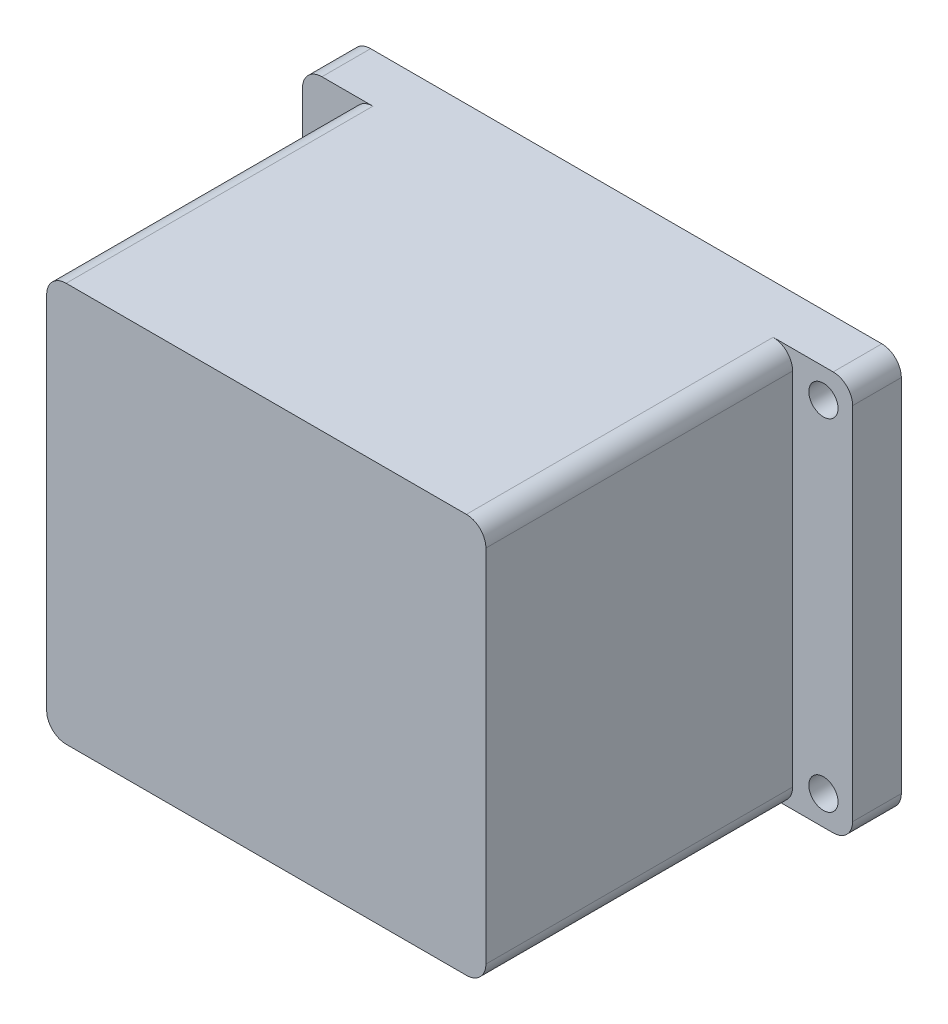
ISO-10303-21;
HEADER;
FILE_DESCRIPTION(('STEP AP214'),'2;1');
FILE_NAME('part.step','',(''),(''),'','','');
FILE_SCHEMA(('AUTOMOTIVE_DESIGN { 1 0 10303 214 1 1 1 1 }'));
ENDSEC;
DATA;
#1=APPLICATION_CONTEXT('core data for automotive mechanical design processes');
#2=APPLICATION_PROTOCOL_DEFINITION('international standard','automotive_design',2000,#1);
#3=PRODUCT_CONTEXT('',#1,'mechanical');
#4=PRODUCT('Part','Part','',(#3));
#5=PRODUCT_RELATED_PRODUCT_CATEGORY('part','',(#4));
#6=PRODUCT_DEFINITION_FORMATION('','',#4);
#7=PRODUCT_DEFINITION_CONTEXT('part definition',#1,'design');
#8=PRODUCT_DEFINITION('design','',#6,#7);
#9=PRODUCT_DEFINITION_SHAPE('','',#8);
#10=(LENGTH_UNIT() NAMED_UNIT(*) SI_UNIT(.MILLI.,.METRE.));
#11=(NAMED_UNIT(*) PLANE_ANGLE_UNIT() SI_UNIT($,.RADIAN.));
#12=(NAMED_UNIT(*) SI_UNIT($,.STERADIAN.) SOLID_ANGLE_UNIT());
#13=UNCERTAINTY_MEASURE_WITH_UNIT(LENGTH_MEASURE(1.E-05),#10,'distance_accuracy_value','');
#14=(GEOMETRIC_REPRESENTATION_CONTEXT(3) GLOBAL_UNCERTAINTY_ASSIGNED_CONTEXT((#13)) GLOBAL_UNIT_ASSIGNED_CONTEXT((#10,
#11,#12)) REPRESENTATION_CONTEXT('',''));
#15=CARTESIAN_POINT('',(0.,0.,0.));
#16=DIRECTION('',(0.,0.,1.));
#17=DIRECTION('',(1.,0.,0.));
#18=AXIS2_PLACEMENT_3D('',#15,#16,#17);
#19=CARTESIAN_POINT('',(0.,0.,5.));
#20=DIRECTION('',(0.,0.,-1.));
#21=DIRECTION('',(-1.,0.,0.));
#22=AXIS2_PLACEMENT_3D('',#19,#20,#21);
#23=PLANE('',#22);
#24=CARTESIAN_POINT('',(53.5,3.,5.));
#25=DIRECTION('',(0.,0.,1.));
#26=DIRECTION('',(1.,0.,0.));
#27=AXIS2_PLACEMENT_3D('',#24,#25,#26);
#28=CIRCLE('',#27,1.5);
#29=CARTESIAN_POINT('',(55.,3.,5.));
#30=VERTEX_POINT('',#29);
#31=EDGE_CURVE('E274',#30,#30,#28,.T.);
#32=ORIENTED_EDGE('',*,*,#31,.F.);
#33=EDGE_LOOP('',(#32));
#34=FACE_BOUND('',#33,.T.);
#35=CARTESIAN_POINT('',(53.5,38.,5.));
#36=DIRECTION('',(0.,0.,1.));
#37=DIRECTION('',(1.,0.,0.));
#38=AXIS2_PLACEMENT_3D('',#35,#36,#37);
#39=CIRCLE('',#38,1.5);
#40=CARTESIAN_POINT('',(55.,38.,5.));
#41=VERTEX_POINT('',#40);
#42=EDGE_CURVE('E280',#41,#41,#39,.T.);
#43=ORIENTED_EDGE('',*,*,#42,.F.);
#44=EDGE_LOOP('',(#43));
#45=FACE_BOUND('',#44,.T.);
#46=DIRECTION('',(0.,1.,0.));
#47=VECTOR('',#46,1.);
#48=CARTESIAN_POINT('',(50.3352560695731,0.,5.));
#49=LINE('',#48,#47);
#50=CARTESIAN_POINT('',(50.3352560695731,2.,5.));
#51=VERTEX_POINT('',#50);
#52=CARTESIAN_POINT('',(50.3352560695731,39.,5.));
#53=VERTEX_POINT('',#52);
#54=EDGE_CURVE('E242',#51,#53,#49,.T.);
#55=ORIENTED_EDGE('',*,*,#54,.F.);
#56=CARTESIAN_POINT('',(48.3352560695731,2.,5.));
#57=DIRECTION('',(0.,0.,-1.));
#58=DIRECTION('',(-1.,0.,0.));
#59=AXIS2_PLACEMENT_3D('',#56,#57,#58);
#60=CIRCLE('',#59,2.);
#61=CARTESIAN_POINT('',(48.3352560695731,0.,5.));
#62=VERTEX_POINT('',#61);
#63=EDGE_CURVE('E238',#51,#62,#60,.T.);
#64=ORIENTED_EDGE('',*,*,#63,.T.);
#65=DIRECTION('',(1.,0.,0.));
#66=VECTOR('',#65,1.);
#67=CARTESIAN_POINT('',(0.,0.,5.));
#68=LINE('',#67,#66);
#69=CARTESIAN_POINT('',(54.5,0.,5.));
#70=VERTEX_POINT('',#69);
#71=EDGE_CURVE('E176',#62,#70,#68,.T.);
#72=ORIENTED_EDGE('',*,*,#71,.T.);
#73=CARTESIAN_POINT('',(54.5,2.,5.));
#74=DIRECTION('',(0.,0.,-1.));
#75=DIRECTION('',(-1.,0.,0.));
#76=AXIS2_PLACEMENT_3D('',#73,#74,#75);
#77=CIRCLE('',#76,2.);
#78=CARTESIAN_POINT('',(56.5,2.,5.));
#79=VERTEX_POINT('',#78);
#80=EDGE_CURVE('E190',#70,#79,#77,.F.);
#81=ORIENTED_EDGE('',*,*,#80,.T.);
#82=DIRECTION('',(0.,1.,0.));
#83=VECTOR('',#82,1.);
#84=CARTESIAN_POINT('',(56.5,0.,5.));
#85=LINE('',#84,#83);
#86=CARTESIAN_POINT('',(56.5,39.,5.));
#87=VERTEX_POINT('',#86);
#88=EDGE_CURVE('E294',#79,#87,#85,.T.);
#89=ORIENTED_EDGE('',*,*,#88,.T.);
#90=CARTESIAN_POINT('',(54.5,39.,5.));
#91=DIRECTION('',(0.,0.,-1.));
#92=DIRECTION('',(-1.,0.,0.));
#93=AXIS2_PLACEMENT_3D('',#90,#91,#92);
#94=CIRCLE('',#93,2.);
#95=CARTESIAN_POINT('',(54.5,41.,5.));
#96=VERTEX_POINT('',#95);
#97=EDGE_CURVE('E196',#87,#96,#94,.F.);
#98=ORIENTED_EDGE('',*,*,#97,.T.);
#99=DIRECTION('',(-1.,0.,0.));
#100=VECTOR('',#99,1.);
#101=CARTESIAN_POINT('',(0.,41.,5.));
#102=LINE('',#101,#100);
#103=CARTESIAN_POINT('',(48.3352560695731,41.,5.));
#104=VERTEX_POINT('',#103);
#105=EDGE_CURVE('E50',#96,#104,#102,.T.);
#106=ORIENTED_EDGE('',*,*,#105,.T.);
#107=CARTESIAN_POINT('',(48.3352560695731,39.,5.));
#108=DIRECTION('',(0.,0.,-1.));
#109=DIRECTION('',(-1.,0.,0.));
#110=AXIS2_PLACEMENT_3D('',#107,#108,#109);
#111=CIRCLE('',#110,2.);
#112=EDGE_CURVE('E43',#104,#53,#111,.T.);
#113=ORIENTED_EDGE('',*,*,#112,.T.);
#114=EDGE_LOOP('',(#55,#64,#72,#81,#89,#98,#106,#113));
#115=FACE_BOUND('',#114,.T.);
#116=ADVANCED_FACE('F35',(#34,#45,#115),#23,.F.);
#117=CARTESIAN_POINT('',(2.8,20.5,5.));
#118=DIRECTION('',(0.,0.,1.));
#119=DIRECTION('',(1.,0.,0.));
#120=AXIS2_PLACEMENT_3D('',#117,#118,#119);
#121=CIRCLE('',#120,1.5);
#122=CARTESIAN_POINT('',(4.3,20.5,5.));
#123=VERTEX_POINT('',#122);
#124=EDGE_CURVE('E286',#123,#123,#121,.T.);
#125=ORIENTED_EDGE('',*,*,#124,.F.);
#126=EDGE_LOOP('',(#125));
#127=FACE_BOUND('',#126,.T.);
#128=DIRECTION('',(0.,-1.,0.));
#129=VECTOR('',#128,1.);
#130=CARTESIAN_POINT('',(5.23188294329202,0.,5.));
#131=LINE('',#130,#129);
#132=CARTESIAN_POINT('',(5.23188294329202,39.,5.));
#133=VERTEX_POINT('',#132);
#134=CARTESIAN_POINT('',(5.23188294329202,2.,5.));
#135=VERTEX_POINT('',#134);
#136=EDGE_CURVE('E251',#133,#135,#131,.T.);
#137=ORIENTED_EDGE('',*,*,#136,.F.);
#138=CARTESIAN_POINT('',(7.23188294329202,39.,5.));
#139=DIRECTION('',(0.,0.,-1.));
#140=DIRECTION('',(-1.,0.,0.));
#141=AXIS2_PLACEMENT_3D('',#138,#139,#140);
#142=CIRCLE('',#141,2.);
#143=CARTESIAN_POINT('',(7.23188294329202,41.,5.));
#144=VERTEX_POINT('',#143);
#145=EDGE_CURVE('E11',#133,#144,#142,.T.);
#146=ORIENTED_EDGE('',*,*,#145,.T.);
#147=CARTESIAN_POINT('',(2.,41.,5.));
#148=VERTEX_POINT('',#147);
#149=EDGE_CURVE('E58',#144,#148,#102,.T.);
#150=ORIENTED_EDGE('',*,*,#149,.T.);
#151=CARTESIAN_POINT('',(2.,39.,5.));
#152=DIRECTION('',(0.,0.,-1.));
#153=DIRECTION('',(-1.,0.,0.));
#154=AXIS2_PLACEMENT_3D('',#151,#152,#153);
#155=CIRCLE('',#154,2.);
#156=CARTESIAN_POINT('',(0.,39.,5.));
#157=VERTEX_POINT('',#156);
#158=EDGE_CURVE('E194',#148,#157,#155,.F.);
#159=ORIENTED_EDGE('',*,*,#158,.T.);
#160=DIRECTION('',(0.,-1.,0.));
#161=VECTOR('',#160,1.);
#162=CARTESIAN_POINT('',(0.,0.,5.));
#163=LINE('',#162,#161);
#164=CARTESIAN_POINT('',(0.,2.,5.));
#165=VERTEX_POINT('',#164);
#166=EDGE_CURVE('E172',#157,#165,#163,.T.);
#167=ORIENTED_EDGE('',*,*,#166,.T.);
#168=CARTESIAN_POINT('',(2.,2.,5.));
#169=DIRECTION('',(0.,0.,-1.));
#170=DIRECTION('',(-1.,0.,0.));
#171=AXIS2_PLACEMENT_3D('',#168,#169,#170);
#172=CIRCLE('',#171,2.);
#173=CARTESIAN_POINT('',(2.,0.,5.));
#174=VERTEX_POINT('',#173);
#175=EDGE_CURVE('E192',#165,#174,#172,.F.);
#176=ORIENTED_EDGE('',*,*,#175,.T.);
#177=CARTESIAN_POINT('',(7.23188294329202,0.,5.));
#178=VERTEX_POINT('',#177);
#179=EDGE_CURVE('E292',#174,#178,#68,.T.);
#180=ORIENTED_EDGE('',*,*,#179,.T.);
#181=CARTESIAN_POINT('',(7.23188294329202,2.,5.));
#182=DIRECTION('',(0.,0.,-1.));
#183=DIRECTION('',(-1.,0.,0.));
#184=AXIS2_PLACEMENT_3D('',#181,#182,#183);
#185=CIRCLE('',#184,2.);
#186=EDGE_CURVE('E236',#178,#135,#185,.T.);
#187=ORIENTED_EDGE('',*,*,#186,.T.);
#188=EDGE_LOOP('',(#137,#146,#150,#159,#167,#176,#180,#187));
#189=FACE_BOUND('',#188,.T.);
#190=ADVANCED_FACE('F325',(#127,#189),#23,.F.);
#191=CARTESIAN_POINT('',(0.,0.,0.));
#192=DIRECTION('',(0.,0.,-1.));
#193=DIRECTION('',(-1.,0.,0.));
#194=AXIS2_PLACEMENT_3D('',#191,#192,#193);
#195=PLANE('',#194);
#196=CARTESIAN_POINT('',(53.5,38.,0.));
#197=DIRECTION('',(0.,0.,1.));
#198=DIRECTION('',(1.,0.,0.));
#199=AXIS2_PLACEMENT_3D('',#196,#197,#198);
#200=CIRCLE('',#199,1.5);
#201=CARTESIAN_POINT('',(55.,38.,0.));
#202=VERTEX_POINT('',#201);
#203=EDGE_CURVE('E277',#202,#202,#200,.T.);
#204=ORIENTED_EDGE('',*,*,#203,.T.);
#205=EDGE_LOOP('',(#204));
#206=FACE_BOUND('',#205,.T.);
#207=DIRECTION('',(-1.,0.,0.));
#208=VECTOR('',#207,1.);
#209=CARTESIAN_POINT('',(0.,41.,0.));
#210=LINE('',#209,#208);
#211=CARTESIAN_POINT('',(54.5,41.,0.));
#212=VERTEX_POINT('',#211);
#213=CARTESIAN_POINT('',(2.,41.,0.));
#214=VERTEX_POINT('',#213);
#215=EDGE_CURVE('E163',#212,#214,#210,.T.);
#216=ORIENTED_EDGE('',*,*,#215,.F.);
#217=CARTESIAN_POINT('',(54.5,39.,0.));
#218=DIRECTION('',(0.,0.,-1.));
#219=DIRECTION('',(-1.,0.,0.));
#220=AXIS2_PLACEMENT_3D('',#217,#218,#219);
#221=CIRCLE('',#220,2.);
#222=CARTESIAN_POINT('',(56.5,39.,0.));
#223=VERTEX_POINT('',#222);
#224=EDGE_CURVE('E147',#212,#223,#221,.T.);
#225=ORIENTED_EDGE('',*,*,#224,.T.);
#226=DIRECTION('',(0.,1.,0.));
#227=VECTOR('',#226,1.);
#228=CARTESIAN_POINT('',(56.5,0.,0.));
#229=LINE('',#228,#227);
#230=CARTESIAN_POINT('',(56.5,2.,0.));
#231=VERTEX_POINT('',#230);
#232=EDGE_CURVE('E173',#231,#223,#229,.T.);
#233=ORIENTED_EDGE('',*,*,#232,.F.);
#234=CARTESIAN_POINT('',(54.5,2.,0.));
#235=DIRECTION('',(0.,0.,-1.));
#236=DIRECTION('',(-1.,0.,0.));
#237=AXIS2_PLACEMENT_3D('',#234,#235,#236);
#238=CIRCLE('',#237,2.);
#239=CARTESIAN_POINT('',(54.5,0.,0.));
#240=VERTEX_POINT('',#239);
#241=EDGE_CURVE('E166',#231,#240,#238,.T.);
#242=ORIENTED_EDGE('',*,*,#241,.T.);
#243=DIRECTION('',(1.,0.,0.));
#244=VECTOR('',#243,1.);
#245=CARTESIAN_POINT('',(0.,0.,0.));
#246=LINE('',#245,#244);
#247=CARTESIAN_POINT('',(2.,0.,0.));
#248=VERTEX_POINT('',#247);
#249=EDGE_CURVE('E178',#248,#240,#246,.T.);
#250=ORIENTED_EDGE('',*,*,#249,.F.);
#251=CARTESIAN_POINT('',(2.,2.,0.));
#252=DIRECTION('',(0.,0.,-1.));
#253=DIRECTION('',(-1.,0.,0.));
#254=AXIS2_PLACEMENT_3D('',#251,#252,#253);
#255=CIRCLE('',#254,2.);
#256=CARTESIAN_POINT('',(0.,2.,0.));
#257=VERTEX_POINT('',#256);
#258=EDGE_CURVE('E184',#248,#257,#255,.T.);
#259=ORIENTED_EDGE('',*,*,#258,.T.);
#260=DIRECTION('',(0.,-1.,0.));
#261=VECTOR('',#260,1.);
#262=CARTESIAN_POINT('',(0.,0.,0.));
#263=LINE('',#262,#261);
#264=CARTESIAN_POINT('',(0.,39.,0.));
#265=VERTEX_POINT('',#264);
#266=EDGE_CURVE('E289',#265,#257,#263,.T.);
#267=ORIENTED_EDGE('',*,*,#266,.F.);
#268=CARTESIAN_POINT('',(2.,39.,0.));
#269=DIRECTION('',(0.,0.,-1.));
#270=DIRECTION('',(-1.,0.,0.));
#271=AXIS2_PLACEMENT_3D('',#268,#269,#270);
#272=CIRCLE('',#271,2.);
#273=EDGE_CURVE('E158',#265,#214,#272,.T.);
#274=ORIENTED_EDGE('',*,*,#273,.T.);
#275=EDGE_LOOP('',(#216,#225,#233,#242,#250,#259,#267,#274));
#276=FACE_BOUND('',#275,.T.);
#277=CARTESIAN_POINT('',(2.8,20.5,0.));
#278=DIRECTION('',(0.,0.,1.));
#279=DIRECTION('',(1.,0.,0.));
#280=AXIS2_PLACEMENT_3D('',#277,#278,#279);
#281=CIRCLE('',#280,1.5);
#282=CARTESIAN_POINT('',(4.3,20.5,0.));
#283=VERTEX_POINT('',#282);
#284=EDGE_CURVE('E283',#283,#283,#281,.T.);
#285=ORIENTED_EDGE('',*,*,#284,.T.);
#286=EDGE_LOOP('',(#285));
#287=FACE_BOUND('',#286,.T.);
#288=CARTESIAN_POINT('',(53.5,3.,0.));
#289=DIRECTION('',(0.,0.,1.));
#290=DIRECTION('',(1.,0.,0.));
#291=AXIS2_PLACEMENT_3D('',#288,#289,#290);
#292=CIRCLE('',#291,1.5);
#293=CARTESIAN_POINT('',(55.,3.,0.));
#294=VERTEX_POINT('',#293);
#295=EDGE_CURVE('E270',#294,#294,#292,.T.);
#296=ORIENTED_EDGE('',*,*,#295,.T.);
#297=EDGE_LOOP('',(#296));
#298=FACE_BOUND('',#297,.T.);
#299=ADVANCED_FACE('F169',(#206,#276,#287,#298),#195,.T.);
#300=CARTESIAN_POINT('',(0.,0.,5.));
#301=DIRECTION('',(1.,0.,0.));
#302=DIRECTION('',(0.,0.,-1.));
#303=AXIS2_PLACEMENT_3D('',#300,#301,#302);
#304=PLANE('',#303);
#305=ORIENTED_EDGE('',*,*,#166,.F.);
#306=DIRECTION('',(0.,0.,-1.));
#307=VECTOR('',#306,1.);
#308=CARTESIAN_POINT('',(0.,39.,5.));
#309=LINE('',#308,#307);
#310=EDGE_CURVE('E200',#157,#265,#309,.T.);
#311=ORIENTED_EDGE('',*,*,#310,.T.);
#312=ORIENTED_EDGE('',*,*,#266,.T.);
#313=DIRECTION('',(0.,0.,-1.));
#314=VECTOR('',#313,1.);
#315=CARTESIAN_POINT('',(0.,2.,5.));
#316=LINE('',#315,#314);
#317=EDGE_CURVE('E198',#257,#165,#316,.F.);
#318=ORIENTED_EDGE('',*,*,#317,.T.);
#319=EDGE_LOOP('',(#305,#311,#312,#318));
#320=FACE_BOUND('',#319,.T.);
#321=ADVANCED_FACE('F322',(#320),#304,.F.);
#322=CARTESIAN_POINT('',(0.,0.,5.));
#323=DIRECTION('',(0.,1.,0.));
#324=DIRECTION('',(0.,0.,1.));
#325=AXIS2_PLACEMENT_3D('',#322,#323,#324);
#326=PLANE('',#325);
#327=DIRECTION('',(1.,0.,0.));
#328=VECTOR('',#327,1.);
#329=CARTESIAN_POINT('',(50.3352560695731,0.,36.5));
#330=LINE('',#329,#328);
#331=CARTESIAN_POINT('',(7.23188294329202,0.,36.5));
#332=VERTEX_POINT('',#331);
#333=CARTESIAN_POINT('',(48.3352560695731,0.,36.5));
#334=VERTEX_POINT('',#333);
#335=EDGE_CURVE('E265',#332,#334,#330,.T.);
#336=ORIENTED_EDGE('',*,*,#335,.F.);
#337=DIRECTION('',(0.,0.,-1.));
#338=VECTOR('',#337,1.);
#339=CARTESIAN_POINT('',(7.23188294329202,0.,5.));
#340=LINE('',#339,#338);
#341=EDGE_CURVE('E211',#332,#178,#340,.T.);
#342=ORIENTED_EDGE('',*,*,#341,.T.);
#343=ORIENTED_EDGE('',*,*,#179,.F.);
#344=DIRECTION('',(0.,0.,-1.));
#345=VECTOR('',#344,1.);
#346=CARTESIAN_POINT('',(2.,0.,5.));
#347=LINE('',#346,#345);
#348=EDGE_CURVE('E206',#174,#248,#347,.T.);
#349=ORIENTED_EDGE('',*,*,#348,.T.);
#350=ORIENTED_EDGE('',*,*,#249,.T.);
#351=DIRECTION('',(0.,0.,-1.));
#352=VECTOR('',#351,1.);
#353=CARTESIAN_POINT('',(54.5,0.,5.));
#354=LINE('',#353,#352);
#355=EDGE_CURVE('E203',#240,#70,#354,.F.);
#356=ORIENTED_EDGE('',*,*,#355,.T.);
#357=ORIENTED_EDGE('',*,*,#71,.F.);
#358=DIRECTION('',(0.,0.,-1.));
#359=VECTOR('',#358,1.);
#360=CARTESIAN_POINT('',(48.3352560695731,0.,5.));
#361=LINE('',#360,#359);
#362=EDGE_CURVE('E209',#62,#334,#361,.F.);
#363=ORIENTED_EDGE('',*,*,#362,.T.);
#364=EDGE_LOOP('',(#336,#342,#343,#349,#350,#356,#357,#363));
#365=FACE_BOUND('',#364,.T.);
#366=ADVANCED_FACE('F304',(#365),#326,.F.);
#367=CARTESIAN_POINT('',(56.5,0.,5.));
#368=DIRECTION('',(-1.,0.,0.));
#369=DIRECTION('',(0.,0.,1.));
#370=AXIS2_PLACEMENT_3D('',#367,#368,#369);
#371=PLANE('',#370);
#372=ORIENTED_EDGE('',*,*,#232,.T.);
#373=DIRECTION('',(0.,0.,-1.));
#374=VECTOR('',#373,1.);
#375=CARTESIAN_POINT('',(56.5,39.,5.));
#376=LINE('',#375,#374);
#377=EDGE_CURVE('E152',#223,#87,#376,.F.);
#378=ORIENTED_EDGE('',*,*,#377,.T.);
#379=ORIENTED_EDGE('',*,*,#88,.F.);
#380=DIRECTION('',(0.,0.,-1.));
#381=VECTOR('',#380,1.);
#382=CARTESIAN_POINT('',(56.5,2.,5.));
#383=LINE('',#382,#381);
#384=EDGE_CURVE('E157',#79,#231,#383,.T.);
#385=ORIENTED_EDGE('',*,*,#384,.T.);
#386=EDGE_LOOP('',(#372,#378,#379,#385));
#387=FACE_BOUND('',#386,.T.);
#388=ADVANCED_FACE('F313',(#387),#371,.F.);
#389=CARTESIAN_POINT('',(0.,41.,5.));
#390=DIRECTION('',(0.,-1.,0.));
#391=DIRECTION('',(0.,0.,-1.));
#392=AXIS2_PLACEMENT_3D('',#389,#390,#391);
#393=PLANE('',#392);
#394=DIRECTION('',(-1.,0.,0.));
#395=VECTOR('',#394,1.);
#396=CARTESIAN_POINT('',(50.3352560695731,41.,36.5));
#397=LINE('',#396,#395);
#398=CARTESIAN_POINT('',(48.3352560695731,41.,36.5));
#399=VERTEX_POINT('',#398);
#400=CARTESIAN_POINT('',(7.23188294329202,41.,36.5));
#401=VERTEX_POINT('',#400);
#402=EDGE_CURVE('E259',#399,#401,#397,.T.);
#403=ORIENTED_EDGE('',*,*,#402,.F.);
#404=DIRECTION('',(0.,0.,-1.));
#405=VECTOR('',#404,1.);
#406=CARTESIAN_POINT('',(48.3352560695731,41.,5.));
#407=LINE('',#406,#405);
#408=EDGE_CURVE('E234',#399,#104,#407,.T.);
#409=ORIENTED_EDGE('',*,*,#408,.T.);
#410=ORIENTED_EDGE('',*,*,#105,.F.);
#411=DIRECTION('',(0.,0.,-1.));
#412=VECTOR('',#411,1.);
#413=CARTESIAN_POINT('',(54.5,41.,5.));
#414=LINE('',#413,#412);
#415=EDGE_CURVE('E151',#96,#212,#414,.T.);
#416=ORIENTED_EDGE('',*,*,#415,.T.);
#417=ORIENTED_EDGE('',*,*,#215,.T.);
#418=DIRECTION('',(0.,0.,-1.));
#419=VECTOR('',#418,1.);
#420=CARTESIAN_POINT('',(2.,41.,5.));
#421=LINE('',#420,#419);
#422=EDGE_CURVE('E167',#214,#148,#421,.F.);
#423=ORIENTED_EDGE('',*,*,#422,.T.);
#424=ORIENTED_EDGE('',*,*,#149,.F.);
#425=DIRECTION('',(0.,0.,-1.));
#426=VECTOR('',#425,1.);
#427=CARTESIAN_POINT('',(7.23188294329202,41.,5.));
#428=LINE('',#427,#426);
#429=EDGE_CURVE('E232',#144,#401,#428,.F.);
#430=ORIENTED_EDGE('',*,*,#429,.T.);
#431=EDGE_LOOP('',(#403,#409,#410,#416,#417,#423,#424,#430));
#432=FACE_BOUND('',#431,.T.);
#433=ADVANCED_FACE('F162',(#432),#393,.F.);
#434=CARTESIAN_POINT('',(2.8,20.5,5.));
#435=DIRECTION('',(0.,0.,-1.));
#436=DIRECTION('',(-1.,0.,0.));
#437=AXIS2_PLACEMENT_3D('',#434,#435,#436);
#438=CYLINDRICAL_SURFACE('',#437,1.5);
#439=ORIENTED_EDGE('',*,*,#124,.T.);
#440=EDGE_LOOP('',(#439));
#441=FACE_BOUND('',#440,.T.);
#442=ORIENTED_EDGE('',*,*,#284,.F.);
#443=EDGE_LOOP('',(#442));
#444=FACE_BOUND('',#443,.T.);
#445=ADVANCED_FACE('F320',(#441,#444),#438,.F.);
#446=CARTESIAN_POINT('',(53.5,38.,5.));
#447=DIRECTION('',(0.,0.,-1.));
#448=DIRECTION('',(-1.,0.,0.));
#449=AXIS2_PLACEMENT_3D('',#446,#447,#448);
#450=CYLINDRICAL_SURFACE('',#449,1.5);
#451=ORIENTED_EDGE('',*,*,#42,.T.);
#452=EDGE_LOOP('',(#451));
#453=FACE_BOUND('',#452,.T.);
#454=ORIENTED_EDGE('',*,*,#203,.F.);
#455=EDGE_LOOP('',(#454));
#456=FACE_BOUND('',#455,.T.);
#457=ADVANCED_FACE('F346',(#453,#456),#450,.F.);
#458=CARTESIAN_POINT('',(53.5,3.,5.));
#459=DIRECTION('',(0.,0.,-1.));
#460=DIRECTION('',(-1.,0.,0.));
#461=AXIS2_PLACEMENT_3D('',#458,#459,#460);
#462=CYLINDRICAL_SURFACE('',#461,1.5);
#463=ORIENTED_EDGE('',*,*,#31,.T.);
#464=EDGE_LOOP('',(#463));
#465=FACE_BOUND('',#464,.T.);
#466=ORIENTED_EDGE('',*,*,#295,.F.);
#467=EDGE_LOOP('',(#466));
#468=FACE_BOUND('',#467,.T.);
#469=ADVANCED_FACE('F348',(#465,#468),#462,.F.);
#470=CARTESIAN_POINT('',(54.5,39.,5.));
#471=DIRECTION('',(0.,0.,-1.));
#472=DIRECTION('',(-1.,0.,0.));
#473=AXIS2_PLACEMENT_3D('',#470,#471,#472);
#474=CYLINDRICAL_SURFACE('',#473,2.);
#475=ORIENTED_EDGE('',*,*,#97,.F.);
#476=ORIENTED_EDGE('',*,*,#377,.F.);
#477=ORIENTED_EDGE('',*,*,#224,.F.);
#478=ORIENTED_EDGE('',*,*,#415,.F.);
#479=EDGE_LOOP('',(#475,#476,#477,#478));
#480=FACE_BOUND('',#479,.T.);
#481=ADVANCED_FACE('F150',(#480),#474,.T.);
#482=CARTESIAN_POINT('',(2.,39.,5.));
#483=DIRECTION('',(0.,0.,-1.));
#484=DIRECTION('',(-1.,0.,0.));
#485=AXIS2_PLACEMENT_3D('',#482,#483,#484);
#486=CYLINDRICAL_SURFACE('',#485,2.);
#487=ORIENTED_EDGE('',*,*,#158,.F.);
#488=ORIENTED_EDGE('',*,*,#422,.F.);
#489=ORIENTED_EDGE('',*,*,#273,.F.);
#490=ORIENTED_EDGE('',*,*,#310,.F.);
#491=EDGE_LOOP('',(#487,#488,#489,#490));
#492=FACE_BOUND('',#491,.T.);
#493=ADVANCED_FACE('F404',(#492),#486,.T.);
#494=CARTESIAN_POINT('',(2.,2.,5.));
#495=DIRECTION('',(0.,0.,-1.));
#496=DIRECTION('',(-1.,0.,0.));
#497=AXIS2_PLACEMENT_3D('',#494,#495,#496);
#498=CYLINDRICAL_SURFACE('',#497,2.);
#499=ORIENTED_EDGE('',*,*,#175,.F.);
#500=ORIENTED_EDGE('',*,*,#317,.F.);
#501=ORIENTED_EDGE('',*,*,#258,.F.);
#502=ORIENTED_EDGE('',*,*,#348,.F.);
#503=EDGE_LOOP('',(#499,#500,#501,#502));
#504=FACE_BOUND('',#503,.T.);
#505=ADVANCED_FACE('F398',(#504),#498,.T.);
#506=CARTESIAN_POINT('',(54.5,2.,5.));
#507=DIRECTION('',(0.,0.,-1.));
#508=DIRECTION('',(-1.,0.,0.));
#509=AXIS2_PLACEMENT_3D('',#506,#507,#508);
#510=CYLINDRICAL_SURFACE('',#509,2.);
#511=ORIENTED_EDGE('',*,*,#80,.F.);
#512=ORIENTED_EDGE('',*,*,#355,.F.);
#513=ORIENTED_EDGE('',*,*,#241,.F.);
#514=ORIENTED_EDGE('',*,*,#384,.F.);
#515=EDGE_LOOP('',(#511,#512,#513,#514));
#516=FACE_BOUND('',#515,.T.);
#517=ADVANCED_FACE('F309',(#516),#510,.T.);
#518=CARTESIAN_POINT('',(50.3352560695731,0.,36.5));
#519=DIRECTION('',(-1.,0.,0.));
#520=DIRECTION('',(0.,0.,1.));
#521=AXIS2_PLACEMENT_3D('',#518,#519,#520);
#522=PLANE('',#521);
#523=DIRECTION('',(0.,1.,0.));
#524=VECTOR('',#523,1.);
#525=CARTESIAN_POINT('',(50.3352560695731,0.,36.5));
#526=LINE('',#525,#524);
#527=CARTESIAN_POINT('',(50.3352560695731,2.,36.5));
#528=VERTEX_POINT('',#527);
#529=CARTESIAN_POINT('',(50.3352560695731,39.,36.5));
#530=VERTEX_POINT('',#529);
#531=EDGE_CURVE('E261',#528,#530,#526,.T.);
#532=ORIENTED_EDGE('',*,*,#531,.F.);
#533=DIRECTION('',(0.,0.,-1.));
#534=VECTOR('',#533,1.);
#535=CARTESIAN_POINT('',(50.3352560695731,2.,36.5));
#536=LINE('',#535,#534);
#537=EDGE_CURVE('E229',#528,#51,#536,.T.);
#538=ORIENTED_EDGE('',*,*,#537,.T.);
#539=ORIENTED_EDGE('',*,*,#54,.T.);
#540=DIRECTION('',(0.,0.,-1.));
#541=VECTOR('',#540,1.);
#542=CARTESIAN_POINT('',(50.3352560695731,39.,36.5));
#543=LINE('',#542,#541);
#544=EDGE_CURVE('E227',#53,#530,#543,.F.);
#545=ORIENTED_EDGE('',*,*,#544,.T.);
#546=EDGE_LOOP('',(#532,#538,#539,#545));
#547=FACE_BOUND('',#546,.T.);
#548=ADVANCED_FACE('F248',(#547),#522,.F.);
#549=CARTESIAN_POINT('',(5.23188294329202,0.,36.5));
#550=DIRECTION('',(1.,0.,0.));
#551=DIRECTION('',(0.,0.,-1.));
#552=AXIS2_PLACEMENT_3D('',#549,#550,#551);
#553=PLANE('',#552);
#554=ORIENTED_EDGE('',*,*,#136,.T.);
#555=DIRECTION('',(0.,0.,-1.));
#556=VECTOR('',#555,1.);
#557=CARTESIAN_POINT('',(5.23188294329202,2.,36.5));
#558=LINE('',#557,#556);
#559=CARTESIAN_POINT('',(5.23188294329202,2.,36.5));
#560=VERTEX_POINT('',#559);
#561=EDGE_CURVE('E217',#135,#560,#558,.F.);
#562=ORIENTED_EDGE('',*,*,#561,.T.);
#563=DIRECTION('',(0.,-1.,0.));
#564=VECTOR('',#563,1.);
#565=CARTESIAN_POINT('',(5.23188294329202,0.,36.5));
#566=LINE('',#565,#564);
#567=CARTESIAN_POINT('',(5.23188294329202,39.,36.5));
#568=VERTEX_POINT('',#567);
#569=EDGE_CURVE('E263',#568,#560,#566,.T.);
#570=ORIENTED_EDGE('',*,*,#569,.F.);
#571=DIRECTION('',(0.,0.,-1.));
#572=VECTOR('',#571,1.);
#573=CARTESIAN_POINT('',(5.23188294329202,39.,36.5));
#574=LINE('',#573,#572);
#575=EDGE_CURVE('E214',#568,#133,#574,.T.);
#576=ORIENTED_EDGE('',*,*,#575,.T.);
#577=EDGE_LOOP('',(#554,#562,#570,#576));
#578=FACE_BOUND('',#577,.T.);
#579=ADVANCED_FACE('F360',(#578),#553,.F.);
#580=CARTESIAN_POINT('',(0.,0.,36.5));
#581=DIRECTION('',(0.,0.,1.));
#582=DIRECTION('',(1.,0.,0.));
#583=AXIS2_PLACEMENT_3D('',#580,#581,#582);
#584=PLANE('',#583);
#585=ORIENTED_EDGE('',*,*,#569,.T.);
#586=CARTESIAN_POINT('',(7.23188294329202,2.,36.5));
#587=DIRECTION('',(0.,0.,1.));
#588=DIRECTION('',(1.,0.,0.));
#589=AXIS2_PLACEMENT_3D('',#586,#587,#588);
#590=CIRCLE('',#589,2.);
#591=EDGE_CURVE('E225',#560,#332,#590,.T.);
#592=ORIENTED_EDGE('',*,*,#591,.T.);
#593=ORIENTED_EDGE('',*,*,#335,.T.);
#594=CARTESIAN_POINT('',(48.3352560695731,2.,36.5));
#595=DIRECTION('',(0.,0.,1.));
#596=DIRECTION('',(1.,0.,0.));
#597=AXIS2_PLACEMENT_3D('',#594,#595,#596);
#598=CIRCLE('',#597,2.);
#599=EDGE_CURVE('E223',#334,#528,#598,.T.);
#600=ORIENTED_EDGE('',*,*,#599,.T.);
#601=ORIENTED_EDGE('',*,*,#531,.T.);
#602=CARTESIAN_POINT('',(48.3352560695731,39.,36.5));
#603=DIRECTION('',(0.,0.,1.));
#604=DIRECTION('',(1.,0.,0.));
#605=AXIS2_PLACEMENT_3D('',#602,#603,#604);
#606=CIRCLE('',#605,2.);
#607=EDGE_CURVE('E221',#530,#399,#606,.T.);
#608=ORIENTED_EDGE('',*,*,#607,.T.);
#609=ORIENTED_EDGE('',*,*,#402,.T.);
#610=CARTESIAN_POINT('',(7.23188294329202,39.,36.5));
#611=DIRECTION('',(0.,0.,1.));
#612=DIRECTION('',(1.,0.,0.));
#613=AXIS2_PLACEMENT_3D('',#610,#611,#612);
#614=CIRCLE('',#613,2.);
#615=EDGE_CURVE('E219',#401,#568,#614,.T.);
#616=ORIENTED_EDGE('',*,*,#615,.T.);
#617=EDGE_LOOP('',(#585,#592,#593,#600,#601,#608,#609,#616));
#618=FACE_BOUND('',#617,.T.);
#619=ADVANCED_FACE('F258',(#618),#584,.T.);
#620=CARTESIAN_POINT('',(7.23188294329202,2.,5.));
#621=DIRECTION('',(0.,0.,-1.));
#622=DIRECTION('',(-1.,0.,0.));
#623=AXIS2_PLACEMENT_3D('',#620,#621,#622);
#624=CYLINDRICAL_SURFACE('',#623,2.);
#625=ORIENTED_EDGE('',*,*,#591,.F.);
#626=ORIENTED_EDGE('',*,*,#561,.F.);
#627=ORIENTED_EDGE('',*,*,#186,.F.);
#628=ORIENTED_EDGE('',*,*,#341,.F.);
#629=EDGE_LOOP('',(#625,#626,#627,#628));
#630=FACE_BOUND('',#629,.T.);
#631=ADVANCED_FACE('F365',(#630),#624,.T.);
#632=CARTESIAN_POINT('',(48.3352560695731,2.,36.5));
#633=DIRECTION('',(0.,0.,-1.));
#634=DIRECTION('',(-1.,0.,0.));
#635=AXIS2_PLACEMENT_3D('',#632,#633,#634);
#636=CYLINDRICAL_SURFACE('',#635,2.);
#637=ORIENTED_EDGE('',*,*,#599,.F.);
#638=ORIENTED_EDGE('',*,*,#362,.F.);
#639=ORIENTED_EDGE('',*,*,#63,.F.);
#640=ORIENTED_EDGE('',*,*,#537,.F.);
#641=EDGE_LOOP('',(#637,#638,#639,#640));
#642=FACE_BOUND('',#641,.T.);
#643=ADVANCED_FACE('F369',(#642),#636,.T.);
#644=CARTESIAN_POINT('',(48.3352560695731,39.,5.));
#645=DIRECTION('',(0.,0.,-1.));
#646=DIRECTION('',(-1.,0.,0.));
#647=AXIS2_PLACEMENT_3D('',#644,#645,#646);
#648=CYLINDRICAL_SURFACE('',#647,2.);
#649=ORIENTED_EDGE('',*,*,#607,.F.);
#650=ORIENTED_EDGE('',*,*,#544,.F.);
#651=ORIENTED_EDGE('',*,*,#112,.F.);
#652=ORIENTED_EDGE('',*,*,#408,.F.);
#653=EDGE_LOOP('',(#649,#650,#651,#652));
#654=FACE_BOUND('',#653,.T.);
#655=ADVANCED_FACE('F254',(#654),#648,.T.);
#656=CARTESIAN_POINT('',(7.23188294329202,39.,36.5));
#657=DIRECTION('',(0.,0.,-1.));
#658=DIRECTION('',(-1.,0.,0.));
#659=AXIS2_PLACEMENT_3D('',#656,#657,#658);
#660=CYLINDRICAL_SURFACE('',#659,2.);
#661=ORIENTED_EDGE('',*,*,#615,.F.);
#662=ORIENTED_EDGE('',*,*,#429,.F.);
#663=ORIENTED_EDGE('',*,*,#145,.F.);
#664=ORIENTED_EDGE('',*,*,#575,.F.);
#665=EDGE_LOOP('',(#661,#662,#663,#664));
#666=FACE_BOUND('',#665,.T.);
#667=ADVANCED_FACE('F37',(#666),#660,.T.);
#668=CLOSED_SHELL('',(#116,#190,#299,#321,#366,#388,#433,#445,#457,#469,#481,#493,#505,#517,
#548,#579,#619,#631,#643,#655,#667));
#669=MANIFOLD_SOLID_BREP('B2',#668);
#670=ADVANCED_BREP_SHAPE_REPRESENTATION('',(#18,#669),#14);
#671=SHAPE_DEFINITION_REPRESENTATION(#9,#670);
ENDSEC;
END-ISO-10303-21;
